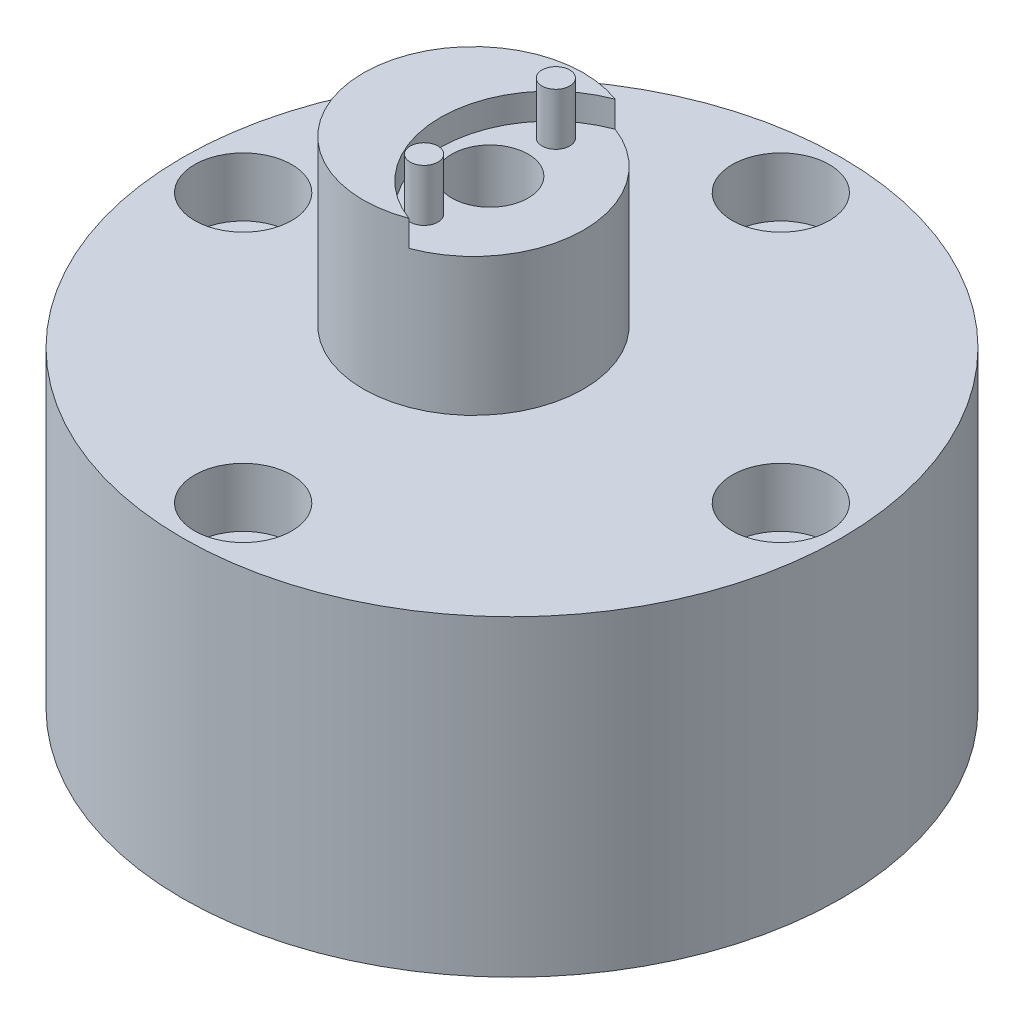
ISO-10303-21;
HEADER;
FILE_DESCRIPTION(('STEP AP214'),'2;1');
FILE_NAME('part.step','',(''),(''),'','','');
FILE_SCHEMA(('AUTOMOTIVE_DESIGN { 1 0 10303 214 1 1 1 1 }'));
ENDSEC;
DATA;
#1=APPLICATION_CONTEXT('core data for automotive mechanical design processes');
#2=APPLICATION_PROTOCOL_DEFINITION('international standard','automotive_design',2000,#1);
#3=PRODUCT_CONTEXT('',#1,'mechanical');
#4=PRODUCT('Part','Part','',(#3));
#5=PRODUCT_RELATED_PRODUCT_CATEGORY('part','',(#4));
#6=PRODUCT_DEFINITION_FORMATION('','',#4);
#7=PRODUCT_DEFINITION_CONTEXT('part definition',#1,'design');
#8=PRODUCT_DEFINITION('design','',#6,#7);
#9=PRODUCT_DEFINITION_SHAPE('','',#8);
#10=(LENGTH_UNIT() NAMED_UNIT(*) SI_UNIT(.MILLI.,.METRE.));
#11=(NAMED_UNIT(*) PLANE_ANGLE_UNIT() SI_UNIT($,.RADIAN.));
#12=(NAMED_UNIT(*) SI_UNIT($,.STERADIAN.) SOLID_ANGLE_UNIT());
#13=UNCERTAINTY_MEASURE_WITH_UNIT(LENGTH_MEASURE(1.E-05),#10,'distance_accuracy_value','');
#14=(GEOMETRIC_REPRESENTATION_CONTEXT(3) GLOBAL_UNCERTAINTY_ASSIGNED_CONTEXT((#13)) GLOBAL_UNIT_ASSIGNED_CONTEXT((#10,
#11,#12)) REPRESENTATION_CONTEXT('',''));
#15=CARTESIAN_POINT('',(0.,0.,0.));
#16=DIRECTION('',(0.,0.,1.));
#17=DIRECTION('',(1.,0.,0.));
#18=AXIS2_PLACEMENT_3D('',#15,#16,#17);
#19=CARTESIAN_POINT('',(0.952245999999999,-18.,0.));
#20=DIRECTION('',(0.,1.,0.));
#21=DIRECTION('',(0.,0.,1.));
#22=AXIS2_PLACEMENT_3D('',#19,#20,#21);
#23=CYLINDRICAL_SURFACE('',#22,2.2);
#24=CARTESIAN_POINT('',(0.952245999999999,7.9375,0.));
#25=DIRECTION('',(0.,1.,0.));
#26=DIRECTION('',(0.,0.,1.));
#27=AXIS2_PLACEMENT_3D('',#24,#25,#26);
#28=CIRCLE('',#27,2.2);
#29=CARTESIAN_POINT('',(0.952245999999999,7.9375,2.2));
#30=VERTEX_POINT('',#29);
#31=EDGE_CURVE('E91',#30,#30,#28,.T.);
#32=ORIENTED_EDGE('',*,*,#31,.T.);
#33=EDGE_LOOP('',(#32));
#34=FACE_BOUND('',#33,.T.);
#35=CARTESIAN_POINT('',(0.952245999999999,-8.,0.));
#36=DIRECTION('',(0.,-1.,0.));
#37=DIRECTION('',(0.,0.,-1.));
#38=AXIS2_PLACEMENT_3D('',#35,#36,#37);
#39=CIRCLE('',#38,2.2);
#40=CARTESIAN_POINT('',(0.952245999999999,-8.,-2.2));
#41=VERTEX_POINT('',#40);
#42=EDGE_CURVE('E48',#41,#41,#39,.F.);
#43=ORIENTED_EDGE('',*,*,#42,.F.);
#44=EDGE_LOOP('',(#43));
#45=FACE_BOUND('',#44,.T.);
#46=ADVANCED_FACE('F44',(#34,#45),#23,.F.);
#47=CARTESIAN_POINT('',(0.,7.9375,0.));
#48=DIRECTION('',(0.,1.,0.));
#49=DIRECTION('',(0.,0.,1.));
#50=AXIS2_PLACEMENT_3D('',#47,#48,#49);
#51=PLANE('',#50);
#52=CARTESIAN_POINT('',(0.952245999999999,7.9375,3.8));
#53=DIRECTION('',(0.,1.,0.));
#54=DIRECTION('',(0.,0.,1.));
#55=AXIS2_PLACEMENT_3D('',#52,#53,#54);
#56=CIRCLE('',#55,0.8);
#57=CARTESIAN_POINT('',(0.952245999999999,7.9375,4.6));
#58=VERTEX_POINT('',#57);
#59=EDGE_CURVE('E525',#58,#58,#56,.T.);
#60=ORIENTED_EDGE('',*,*,#59,.F.);
#61=EDGE_LOOP('',(#60));
#62=FACE_BOUND('',#61,.T.);
#63=CARTESIAN_POINT('',(0.952245999999999,7.9375,-3.8));
#64=DIRECTION('',(0.,1.,0.));
#65=DIRECTION('',(0.,0.,1.));
#66=AXIS2_PLACEMENT_3D('',#63,#64,#65);
#67=CIRCLE('',#66,0.8);
#68=CARTESIAN_POINT('',(0.952245999999999,7.9375,-3.));
#69=VERTEX_POINT('',#68);
#70=EDGE_CURVE('E529',#69,#69,#67,.T.);
#71=ORIENTED_EDGE('',*,*,#70,.F.);
#72=EDGE_LOOP('',(#71));
#73=FACE_BOUND('',#72,.T.);
#74=ORIENTED_EDGE('',*,*,#31,.F.);
#75=EDGE_LOOP('',(#74));
#76=FACE_BOUND('',#75,.T.);
#77=CARTESIAN_POINT('',(4.442246,7.9375,0.));
#78=DIRECTION('',(0.,-1.,0.));
#79=DIRECTION('',(0.,0.,1.));
#80=AXIS2_PLACEMENT_3D('',#77,#78,#79);
#81=CIRCLE('',#80,6.35);
#82=CARTESIAN_POINT('',(2.221123,7.9375,5.94887490361589));
#83=VERTEX_POINT('',#82);
#84=CARTESIAN_POINT('',(2.221123,7.9375,-5.94887490361589));
#85=VERTEX_POINT('',#84);
#86=EDGE_CURVE('E60',#83,#85,#81,.T.);
#87=ORIENTED_EDGE('',*,*,#86,.F.);
#88=CARTESIAN_POINT('',(0.,7.9375,0.));
#89=DIRECTION('',(0.,1.,0.));
#90=DIRECTION('',(0.,0.,1.));
#91=AXIS2_PLACEMENT_3D('',#88,#89,#90);
#92=CIRCLE('',#91,6.35);
#93=EDGE_CURVE('E11',#83,#85,#92,.T.);
#94=ORIENTED_EDGE('',*,*,#93,.T.);
#95=EDGE_LOOP('',(#87,#94));
#96=FACE_BOUND('',#95,.T.);
#97=ADVANCED_FACE('F72',(#62,#73,#76,#96),#51,.T.);
#98=CARTESIAN_POINT('',(-13.277754,7.9375,0.));
#99=DIRECTION('',(0.,-1.,0.));
#100=DIRECTION('',(0.,0.,-1.));
#101=AXIS2_PLACEMENT_3D('',#98,#99,#100);
#102=CYLINDRICAL_SURFACE('',#101,1.7);
#103=CARTESIAN_POINT('',(-13.277754,-18.,0.));
#104=DIRECTION('',(0.,-1.,0.));
#105=DIRECTION('',(0.,0.,-1.));
#106=AXIS2_PLACEMENT_3D('',#103,#104,#105);
#107=CIRCLE('',#106,1.7);
#108=CARTESIAN_POINT('',(-13.277754,-18.,-1.7));
#109=VERTEX_POINT('',#108);
#110=EDGE_CURVE('E144',#109,#109,#107,.T.);
#111=ORIENTED_EDGE('',*,*,#110,.T.);
#112=EDGE_LOOP('',(#111));
#113=FACE_BOUND('',#112,.T.);
#114=CARTESIAN_POINT('',(-13.277754,-3.4,0.));
#115=DIRECTION('',(0.,1.,0.));
#116=DIRECTION('',(0.,0.,1.));
#117=AXIS2_PLACEMENT_3D('',#114,#115,#116);
#118=CIRCLE('',#117,1.7);
#119=CARTESIAN_POINT('',(-13.277754,-3.4,1.7));
#120=VERTEX_POINT('',#119);
#121=EDGE_CURVE('E148',#120,#120,#118,.F.);
#122=ORIENTED_EDGE('',*,*,#121,.F.);
#123=EDGE_LOOP('',(#122));
#124=FACE_BOUND('',#123,.T.);
#125=ADVANCED_FACE('F175',(#113,#124),#102,.F.);
#126=CARTESIAN_POINT('',(2.222246,7.9375,-15.5));
#127=DIRECTION('',(0.,-1.,0.));
#128=DIRECTION('',(0.,0.,-1.));
#129=AXIS2_PLACEMENT_3D('',#126,#127,#128);
#130=CYLINDRICAL_SURFACE('',#129,1.7);
#131=CARTESIAN_POINT('',(2.222246,-18.,-15.5));
#132=DIRECTION('',(0.,-1.,0.));
#133=DIRECTION('',(0.,0.,-1.));
#134=AXIS2_PLACEMENT_3D('',#131,#132,#133);
#135=CIRCLE('',#134,1.7);
#136=CARTESIAN_POINT('',(2.222246,-18.,-17.2));
#137=VERTEX_POINT('',#136);
#138=EDGE_CURVE('E140',#137,#137,#135,.T.);
#139=ORIENTED_EDGE('',*,*,#138,.T.);
#140=EDGE_LOOP('',(#139));
#141=FACE_BOUND('',#140,.T.);
#142=CARTESIAN_POINT('',(2.222246,-3.4,-15.5));
#143=DIRECTION('',(0.,1.,0.));
#144=DIRECTION('',(0.,0.,1.));
#145=AXIS2_PLACEMENT_3D('',#142,#143,#144);
#146=CIRCLE('',#145,1.7);
#147=CARTESIAN_POINT('',(2.222246,-3.4,-13.8));
#148=VERTEX_POINT('',#147);
#149=EDGE_CURVE('E166',#148,#148,#146,.F.);
#150=ORIENTED_EDGE('',*,*,#149,.F.);
#151=EDGE_LOOP('',(#150));
#152=FACE_BOUND('',#151,.T.);
#153=ADVANCED_FACE('F177',(#141,#152),#130,.F.);
#154=CARTESIAN_POINT('',(17.722246,7.9375,0.));
#155=DIRECTION('',(0.,-1.,0.));
#156=DIRECTION('',(0.,0.,-1.));
#157=AXIS2_PLACEMENT_3D('',#154,#155,#156);
#158=CYLINDRICAL_SURFACE('',#157,1.7);
#159=CARTESIAN_POINT('',(17.722246,-18.,0.));
#160=DIRECTION('',(0.,-1.,0.));
#161=DIRECTION('',(0.,0.,-1.));
#162=AXIS2_PLACEMENT_3D('',#159,#160,#161);
#163=CIRCLE('',#162,1.7);
#164=CARTESIAN_POINT('',(17.722246,-18.,-1.7));
#165=VERTEX_POINT('',#164);
#166=EDGE_CURVE('E136',#165,#165,#163,.T.);
#167=ORIENTED_EDGE('',*,*,#166,.T.);
#168=EDGE_LOOP('',(#167));
#169=FACE_BOUND('',#168,.T.);
#170=CARTESIAN_POINT('',(17.722246,-3.4,0.));
#171=DIRECTION('',(0.,1.,0.));
#172=DIRECTION('',(0.,0.,1.));
#173=AXIS2_PLACEMENT_3D('',#170,#171,#172);
#174=CIRCLE('',#173,1.7);
#175=CARTESIAN_POINT('',(17.722246,-3.4,1.7));
#176=VERTEX_POINT('',#175);
#177=EDGE_CURVE('E162',#176,#176,#174,.F.);
#178=ORIENTED_EDGE('',*,*,#177,.F.);
#179=EDGE_LOOP('',(#178));
#180=FACE_BOUND('',#179,.T.);
#181=ADVANCED_FACE('F184',(#169,#180),#158,.F.);
#182=CARTESIAN_POINT('',(2.222246,7.9375,15.5));
#183=DIRECTION('',(0.,-1.,0.));
#184=DIRECTION('',(0.,0.,-1.));
#185=AXIS2_PLACEMENT_3D('',#182,#183,#184);
#186=CYLINDRICAL_SURFACE('',#185,1.7);
#187=CARTESIAN_POINT('',(2.222246,-18.,15.5));
#188=DIRECTION('',(0.,-1.,0.));
#189=DIRECTION('',(0.,0.,-1.));
#190=AXIS2_PLACEMENT_3D('',#187,#188,#189);
#191=CIRCLE('',#190,1.7);
#192=CARTESIAN_POINT('',(2.222246,-18.,13.8));
#193=VERTEX_POINT('',#192);
#194=EDGE_CURVE('E131',#193,#193,#191,.T.);
#195=ORIENTED_EDGE('',*,*,#194,.T.);
#196=EDGE_LOOP('',(#195));
#197=FACE_BOUND('',#196,.T.);
#198=CARTESIAN_POINT('',(2.222246,-3.4,15.5));
#199=DIRECTION('',(0.,1.,0.));
#200=DIRECTION('',(0.,0.,1.));
#201=AXIS2_PLACEMENT_3D('',#198,#199,#200);
#202=CIRCLE('',#201,1.7);
#203=CARTESIAN_POINT('',(2.222246,-3.4,17.2));
#204=VERTEX_POINT('',#203);
#205=EDGE_CURVE('E103',#204,#204,#202,.F.);
#206=ORIENTED_EDGE('',*,*,#205,.F.);
#207=EDGE_LOOP('',(#206));
#208=FACE_BOUND('',#207,.T.);
#209=ADVANCED_FACE('F232',(#197,#208),#186,.F.);
#210=CARTESIAN_POINT('',(0.,7.9375,0.));
#211=DIRECTION('',(0.,-1.,0.));
#212=DIRECTION('',(0.,0.,-1.));
#213=AXIS2_PLACEMENT_3D('',#210,#211,#212);
#214=CYLINDRICAL_SURFACE('',#213,6.35);
#215=ORIENTED_EDGE('',*,*,#93,.F.);
#216=DIRECTION('',(0.,-1.,0.));
#217=VECTOR('',#216,1.);
#218=CARTESIAN_POINT('',(2.22112299999999,9.4375,5.94887490361589));
#219=LINE('',#218,#217);
#220=CARTESIAN_POINT('',(2.22112299999999,9.4375,5.94887490361589));
#221=VERTEX_POINT('',#220);
#222=EDGE_CURVE('E81',#221,#83,#219,.T.);
#223=ORIENTED_EDGE('',*,*,#222,.F.);
#224=CARTESIAN_POINT('',(0.,9.4375,0.));
#225=DIRECTION('',(0.,1.,0.));
#226=DIRECTION('',(0.,0.,1.));
#227=AXIS2_PLACEMENT_3D('',#224,#225,#226);
#228=CIRCLE('',#227,6.35);
#229=CARTESIAN_POINT('',(2.221123,9.4375,-5.94887490361589));
#230=VERTEX_POINT('',#229);
#231=EDGE_CURVE('E83',#230,#221,#228,.T.);
#232=ORIENTED_EDGE('',*,*,#231,.F.);
#233=DIRECTION('',(0.,-1.,0.));
#234=VECTOR('',#233,1.);
#235=CARTESIAN_POINT('',(2.221123,9.4375,-5.94887490361589));
#236=LINE('',#235,#234);
#237=EDGE_CURVE('E79',#230,#85,#236,.T.);
#238=ORIENTED_EDGE('',*,*,#237,.T.);
#239=EDGE_LOOP('',(#215,#223,#232,#238));
#240=FACE_BOUND('',#239,.T.);
#241=CARTESIAN_POINT('',(0.,0.,0.));
#242=DIRECTION('',(0.,1.,0.));
#243=DIRECTION('',(0.,0.,1.));
#244=AXIS2_PLACEMENT_3D('',#241,#242,#243);
#245=CIRCLE('',#244,6.35);
#246=CARTESIAN_POINT('',(0.,0.,6.35));
#247=VERTEX_POINT('',#246);
#248=EDGE_CURVE('E54',#247,#247,#245,.T.);
#249=ORIENTED_EDGE('',*,*,#248,.T.);
#250=EDGE_LOOP('',(#249));
#251=FACE_BOUND('',#250,.T.);
#252=ADVANCED_FACE('F46',(#240,#251),#214,.T.);
#253=CARTESIAN_POINT('',(2.222246,-18.,0.));
#254=DIRECTION('',(0.,1.,0.));
#255=DIRECTION('',(0.,0.,1.));
#256=AXIS2_PLACEMENT_3D('',#253,#254,#255);
#257=CYLINDRICAL_SURFACE('',#256,19.);
#258=CARTESIAN_POINT('',(2.222246,-18.,0.));
#259=DIRECTION('',(0.,-1.,0.));
#260=DIRECTION('',(0.,0.,-1.));
#261=AXIS2_PLACEMENT_3D('',#258,#259,#260);
#262=CIRCLE('',#261,19.);
#263=CARTESIAN_POINT('',(2.222246,-18.,-19.));
#264=VERTEX_POINT('',#263);
#265=EDGE_CURVE('E149',#264,#264,#262,.T.);
#266=ORIENTED_EDGE('',*,*,#265,.F.);
#267=EDGE_LOOP('',(#266));
#268=FACE_BOUND('',#267,.T.);
#269=CARTESIAN_POINT('',(2.222246,0.,0.));
#270=DIRECTION('',(0.,-1.,0.));
#271=DIRECTION('',(0.,0.,-1.));
#272=AXIS2_PLACEMENT_3D('',#269,#270,#271);
#273=CIRCLE('',#272,19.);
#274=CARTESIAN_POINT('',(2.222246,0.,-19.));
#275=VERTEX_POINT('',#274);
#276=EDGE_CURVE('E135',#275,#275,#273,.T.);
#277=ORIENTED_EDGE('',*,*,#276,.T.);
#278=EDGE_LOOP('',(#277));
#279=FACE_BOUND('',#278,.T.);
#280=ADVANCED_FACE('F247',(#268,#279),#257,.T.);
#281=CARTESIAN_POINT('',(2.222246,-18.,0.));
#282=DIRECTION('',(0.,-1.,0.));
#283=DIRECTION('',(0.,0.,-1.));
#284=AXIS2_PLACEMENT_3D('',#281,#282,#283);
#285=PLANE('',#284);
#286=CARTESIAN_POINT('',(2.222246,-18.,0.));
#287=DIRECTION('',(0.,-1.,0.));
#288=DIRECTION('',(0.,0.,-1.));
#289=AXIS2_PLACEMENT_3D('',#286,#287,#288);
#290=CIRCLE('',#289,6.);
#291=CARTESIAN_POINT('',(2.222246,-18.,-6.));
#292=VERTEX_POINT('',#291);
#293=EDGE_CURVE('E519',#292,#292,#290,.T.);
#294=ORIENTED_EDGE('',*,*,#293,.F.);
#295=EDGE_LOOP('',(#294));
#296=FACE_BOUND('',#295,.T.);
#297=ORIENTED_EDGE('',*,*,#194,.F.);
#298=EDGE_LOOP('',(#297));
#299=FACE_BOUND('',#298,.T.);
#300=ORIENTED_EDGE('',*,*,#166,.F.);
#301=EDGE_LOOP('',(#300));
#302=FACE_BOUND('',#301,.T.);
#303=ORIENTED_EDGE('',*,*,#138,.F.);
#304=EDGE_LOOP('',(#303));
#305=FACE_BOUND('',#304,.T.);
#306=ORIENTED_EDGE('',*,*,#110,.F.);
#307=EDGE_LOOP('',(#306));
#308=FACE_BOUND('',#307,.T.);
#309=ORIENTED_EDGE('',*,*,#265,.T.);
#310=EDGE_LOOP('',(#309));
#311=FACE_BOUND('',#310,.T.);
#312=ADVANCED_FACE('F245',(#296,#299,#302,#305,#308,#311),#285,.T.);
#313=CARTESIAN_POINT('',(2.222246,0.,0.));
#314=DIRECTION('',(0.,-1.,0.));
#315=DIRECTION('',(0.,0.,-1.));
#316=AXIS2_PLACEMENT_3D('',#313,#314,#315);
#317=PLANE('',#316);
#318=CARTESIAN_POINT('',(2.222246,0.,-15.5));
#319=DIRECTION('',(0.,1.,0.));
#320=DIRECTION('',(0.,0.,1.));
#321=AXIS2_PLACEMENT_3D('',#318,#319,#320);
#322=CIRCLE('',#321,2.8);
#323=CARTESIAN_POINT('',(2.222246,0.,-12.7));
#324=VERTEX_POINT('',#323);
#325=EDGE_CURVE('E104',#324,#324,#322,.T.);
#326=ORIENTED_EDGE('',*,*,#325,.F.);
#327=EDGE_LOOP('',(#326));
#328=FACE_BOUND('',#327,.T.);
#329=CARTESIAN_POINT('',(17.722246,0.,0.));
#330=DIRECTION('',(0.,1.,0.));
#331=DIRECTION('',(0.,0.,1.));
#332=AXIS2_PLACEMENT_3D('',#329,#330,#331);
#333=CIRCLE('',#332,2.8);
#334=CARTESIAN_POINT('',(17.722246,0.,2.8));
#335=VERTEX_POINT('',#334);
#336=EDGE_CURVE('E108',#335,#335,#333,.T.);
#337=ORIENTED_EDGE('',*,*,#336,.F.);
#338=EDGE_LOOP('',(#337));
#339=FACE_BOUND('',#338,.T.);
#340=CARTESIAN_POINT('',(2.222246,0.,15.5));
#341=DIRECTION('',(0.,1.,0.));
#342=DIRECTION('',(0.,0.,1.));
#343=AXIS2_PLACEMENT_3D('',#340,#341,#342);
#344=CIRCLE('',#343,2.8);
#345=CARTESIAN_POINT('',(2.222246,0.,18.3));
#346=VERTEX_POINT('',#345);
#347=EDGE_CURVE('E116',#346,#346,#344,.T.);
#348=ORIENTED_EDGE('',*,*,#347,.F.);
#349=EDGE_LOOP('',(#348));
#350=FACE_BOUND('',#349,.T.);
#351=CARTESIAN_POINT('',(-13.277754,0.,0.));
#352=DIRECTION('',(0.,1.,0.));
#353=DIRECTION('',(0.,0.,1.));
#354=AXIS2_PLACEMENT_3D('',#351,#352,#353);
#355=CIRCLE('',#354,2.8);
#356=CARTESIAN_POINT('',(-13.277754,0.,2.8));
#357=VERTEX_POINT('',#356);
#358=EDGE_CURVE('E124',#357,#357,#355,.T.);
#359=ORIENTED_EDGE('',*,*,#358,.F.);
#360=EDGE_LOOP('',(#359));
#361=FACE_BOUND('',#360,.T.);
#362=ORIENTED_EDGE('',*,*,#248,.F.);
#363=EDGE_LOOP('',(#362));
#364=FACE_BOUND('',#363,.T.);
#365=ORIENTED_EDGE('',*,*,#276,.F.);
#366=EDGE_LOOP('',(#365));
#367=FACE_BOUND('',#366,.T.);
#368=ADVANCED_FACE('F223',(#328,#339,#350,#361,#364,#367),#317,.F.);
#369=CARTESIAN_POINT('',(2.222246,-3.4,15.5));
#370=DIRECTION('',(0.,1.,0.));
#371=DIRECTION('',(0.,0.,1.));
#372=AXIS2_PLACEMENT_3D('',#369,#370,#371);
#373=PLANE('',#372);
#374=CARTESIAN_POINT('',(2.222246,-3.4,15.5));
#375=DIRECTION('',(0.,1.,0.));
#376=DIRECTION('',(0.,0.,1.));
#377=AXIS2_PLACEMENT_3D('',#374,#375,#376);
#378=CIRCLE('',#377,2.8);
#379=CARTESIAN_POINT('',(2.222246,-3.4,18.3));
#380=VERTEX_POINT('',#379);
#381=EDGE_CURVE('E120',#380,#380,#378,.T.);
#382=ORIENTED_EDGE('',*,*,#381,.T.);
#383=EDGE_LOOP('',(#382));
#384=FACE_BOUND('',#383,.T.);
#385=ORIENTED_EDGE('',*,*,#205,.T.);
#386=EDGE_LOOP('',(#385));
#387=FACE_BOUND('',#386,.T.);
#388=ADVANCED_FACE('F219',(#384,#387),#373,.T.);
#389=CARTESIAN_POINT('',(2.222246,-3.4,15.5));
#390=DIRECTION('',(0.,1.,0.));
#391=DIRECTION('',(0.,0.,1.));
#392=AXIS2_PLACEMENT_3D('',#389,#390,#391);
#393=CYLINDRICAL_SURFACE('',#392,2.8);
#394=ORIENTED_EDGE('',*,*,#381,.F.);
#395=EDGE_LOOP('',(#394));
#396=FACE_BOUND('',#395,.T.);
#397=ORIENTED_EDGE('',*,*,#347,.T.);
#398=EDGE_LOOP('',(#397));
#399=FACE_BOUND('',#398,.T.);
#400=ADVANCED_FACE('F215',(#396,#399),#393,.F.);
#401=CARTESIAN_POINT('',(17.722246,-3.4,0.));
#402=DIRECTION('',(0.,1.,0.));
#403=DIRECTION('',(0.,0.,1.));
#404=AXIS2_PLACEMENT_3D('',#401,#402,#403);
#405=PLANE('',#404);
#406=CARTESIAN_POINT('',(17.722246,-3.4,0.));
#407=DIRECTION('',(0.,1.,0.));
#408=DIRECTION('',(0.,0.,1.));
#409=AXIS2_PLACEMENT_3D('',#406,#407,#408);
#410=CIRCLE('',#409,2.8);
#411=CARTESIAN_POINT('',(17.722246,-3.4,2.8));
#412=VERTEX_POINT('',#411);
#413=EDGE_CURVE('E112',#412,#412,#410,.T.);
#414=ORIENTED_EDGE('',*,*,#413,.T.);
#415=EDGE_LOOP('',(#414));
#416=FACE_BOUND('',#415,.T.);
#417=ORIENTED_EDGE('',*,*,#177,.T.);
#418=EDGE_LOOP('',(#417));
#419=FACE_BOUND('',#418,.T.);
#420=ADVANCED_FACE('F211',(#416,#419),#405,.T.);
#421=CARTESIAN_POINT('',(17.722246,-3.4,0.));
#422=DIRECTION('',(0.,1.,0.));
#423=DIRECTION('',(0.,0.,1.));
#424=AXIS2_PLACEMENT_3D('',#421,#422,#423);
#425=CYLINDRICAL_SURFACE('',#424,2.8);
#426=ORIENTED_EDGE('',*,*,#413,.F.);
#427=EDGE_LOOP('',(#426));
#428=FACE_BOUND('',#427,.T.);
#429=ORIENTED_EDGE('',*,*,#336,.T.);
#430=EDGE_LOOP('',(#429));
#431=FACE_BOUND('',#430,.T.);
#432=ADVANCED_FACE('F204',(#428,#431),#425,.F.);
#433=CARTESIAN_POINT('',(2.222246,-3.4,-15.5));
#434=DIRECTION('',(0.,1.,0.));
#435=DIRECTION('',(0.,0.,1.));
#436=AXIS2_PLACEMENT_3D('',#433,#434,#435);
#437=PLANE('',#436);
#438=CARTESIAN_POINT('',(2.222246,-3.4,-15.5));
#439=DIRECTION('',(0.,1.,0.));
#440=DIRECTION('',(0.,0.,1.));
#441=AXIS2_PLACEMENT_3D('',#438,#439,#440);
#442=CIRCLE('',#441,2.8);
#443=CARTESIAN_POINT('',(2.222246,-3.4,-12.7));
#444=VERTEX_POINT('',#443);
#445=EDGE_CURVE('E99',#444,#444,#442,.T.);
#446=ORIENTED_EDGE('',*,*,#445,.T.);
#447=EDGE_LOOP('',(#446));
#448=FACE_BOUND('',#447,.T.);
#449=ORIENTED_EDGE('',*,*,#149,.T.);
#450=EDGE_LOOP('',(#449));
#451=FACE_BOUND('',#450,.T.);
#452=ADVANCED_FACE('F200',(#448,#451),#437,.T.);
#453=CARTESIAN_POINT('',(2.222246,-3.4,-15.5));
#454=DIRECTION('',(0.,1.,0.));
#455=DIRECTION('',(0.,0.,1.));
#456=AXIS2_PLACEMENT_3D('',#453,#454,#455);
#457=CYLINDRICAL_SURFACE('',#456,2.8);
#458=ORIENTED_EDGE('',*,*,#445,.F.);
#459=EDGE_LOOP('',(#458));
#460=FACE_BOUND('',#459,.T.);
#461=ORIENTED_EDGE('',*,*,#325,.T.);
#462=EDGE_LOOP('',(#461));
#463=FACE_BOUND('',#462,.T.);
#464=ADVANCED_FACE('F203',(#460,#463),#457,.F.);
#465=CARTESIAN_POINT('',(-13.277754,-3.4,0.));
#466=DIRECTION('',(0.,1.,0.));
#467=DIRECTION('',(0.,0.,1.));
#468=AXIS2_PLACEMENT_3D('',#465,#466,#467);
#469=PLANE('',#468);
#470=CARTESIAN_POINT('',(-13.277754,-3.4,0.));
#471=DIRECTION('',(0.,1.,0.));
#472=DIRECTION('',(0.,0.,1.));
#473=AXIS2_PLACEMENT_3D('',#470,#471,#472);
#474=CIRCLE('',#473,2.8);
#475=CARTESIAN_POINT('',(-13.277754,-3.4,2.8));
#476=VERTEX_POINT('',#475);
#477=EDGE_CURVE('E98',#476,#476,#474,.T.);
#478=ORIENTED_EDGE('',*,*,#477,.T.);
#479=EDGE_LOOP('',(#478));
#480=FACE_BOUND('',#479,.T.);
#481=ORIENTED_EDGE('',*,*,#121,.T.);
#482=EDGE_LOOP('',(#481));
#483=FACE_BOUND('',#482,.T.);
#484=ADVANCED_FACE('F173',(#480,#483),#469,.T.);
#485=CARTESIAN_POINT('',(-13.277754,-3.4,0.));
#486=DIRECTION('',(0.,1.,0.));
#487=DIRECTION('',(0.,0.,1.));
#488=AXIS2_PLACEMENT_3D('',#485,#486,#487);
#489=CYLINDRICAL_SURFACE('',#488,2.8);
#490=ORIENTED_EDGE('',*,*,#477,.F.);
#491=EDGE_LOOP('',(#490));
#492=FACE_BOUND('',#491,.T.);
#493=ORIENTED_EDGE('',*,*,#358,.T.);
#494=EDGE_LOOP('',(#493));
#495=FACE_BOUND('',#494,.T.);
#496=ADVANCED_FACE('F225',(#492,#495),#489,.F.);
#497=CARTESIAN_POINT('',(4.442246,9.4375,0.));
#498=DIRECTION('',(0.,-1.,0.));
#499=DIRECTION('',(0.,0.,-1.));
#500=AXIS2_PLACEMENT_3D('',#497,#498,#499);
#501=CYLINDRICAL_SURFACE('',#500,6.35);
#502=ORIENTED_EDGE('',*,*,#86,.T.);
#503=ORIENTED_EDGE('',*,*,#237,.F.);
#504=CARTESIAN_POINT('',(4.442246,9.4375,0.));
#505=DIRECTION('',(0.,-1.,0.));
#506=DIRECTION('',(0.,0.,1.));
#507=AXIS2_PLACEMENT_3D('',#504,#505,#506);
#508=CIRCLE('',#507,6.35);
#509=EDGE_CURVE('E68',#221,#230,#508,.T.);
#510=ORIENTED_EDGE('',*,*,#509,.F.);
#511=ORIENTED_EDGE('',*,*,#222,.T.);
#512=EDGE_LOOP('',(#502,#503,#510,#511));
#513=FACE_BOUND('',#512,.T.);
#514=ADVANCED_FACE('F78',(#513),#501,.F.);
#515=CARTESIAN_POINT('',(2.221123,9.4375,0.));
#516=DIRECTION('',(0.,1.,0.));
#517=DIRECTION('',(0.,0.,1.));
#518=AXIS2_PLACEMENT_3D('',#515,#516,#517);
#519=PLANE('',#518);
#520=ORIENTED_EDGE('',*,*,#231,.T.);
#521=ORIENTED_EDGE('',*,*,#509,.T.);
#522=EDGE_LOOP('',(#520,#521));
#523=FACE_BOUND('',#522,.T.);
#524=ADVANCED_FACE('F336',(#523),#519,.T.);
#525=CARTESIAN_POINT('',(0.952245999999999,10.9375,-3.8));
#526=DIRECTION('',(0.,-1.,0.));
#527=DIRECTION('',(0.,0.,-1.));
#528=AXIS2_PLACEMENT_3D('',#525,#526,#527);
#529=CYLINDRICAL_SURFACE('',#528,0.8);
#530=CARTESIAN_POINT('',(0.952245999999999,10.9375,-3.8));
#531=DIRECTION('',(0.,1.,0.));
#532=DIRECTION('',(0.,0.,1.));
#533=AXIS2_PLACEMENT_3D('',#530,#531,#532);
#534=CIRCLE('',#533,0.8);
#535=CARTESIAN_POINT('',(0.952245999999999,10.9375,-3.));
#536=VERTEX_POINT('',#535);
#537=EDGE_CURVE('E84',#536,#536,#534,.T.);
#538=ORIENTED_EDGE('',*,*,#537,.F.);
#539=EDGE_LOOP('',(#538));
#540=FACE_BOUND('',#539,.T.);
#541=ORIENTED_EDGE('',*,*,#70,.T.);
#542=EDGE_LOOP('',(#541));
#543=FACE_BOUND('',#542,.T.);
#544=ADVANCED_FACE('F342',(#540,#543),#529,.T.);
#545=CARTESIAN_POINT('',(0.952245999999999,10.9375,-3.8));
#546=DIRECTION('',(0.,1.,0.));
#547=DIRECTION('',(0.,0.,1.));
#548=AXIS2_PLACEMENT_3D('',#545,#546,#547);
#549=PLANE('',#548);
#550=ORIENTED_EDGE('',*,*,#537,.T.);
#551=EDGE_LOOP('',(#550));
#552=FACE_BOUND('',#551,.T.);
#553=ADVANCED_FACE('F349',(#552),#549,.T.);
#554=CARTESIAN_POINT('',(0.952245999999999,10.9375,3.8));
#555=DIRECTION('',(0.,-1.,0.));
#556=DIRECTION('',(0.,0.,-1.));
#557=AXIS2_PLACEMENT_3D('',#554,#555,#556);
#558=CYLINDRICAL_SURFACE('',#557,0.8);
#559=CARTESIAN_POINT('',(0.952245999999999,10.9375,3.8));
#560=DIRECTION('',(0.,1.,0.));
#561=DIRECTION('',(0.,0.,1.));
#562=AXIS2_PLACEMENT_3D('',#559,#560,#561);
#563=CIRCLE('',#562,0.8);
#564=CARTESIAN_POINT('',(0.952245999999999,10.9375,4.6));
#565=VERTEX_POINT('',#564);
#566=EDGE_CURVE('E530',#565,#565,#563,.T.);
#567=ORIENTED_EDGE('',*,*,#566,.F.);
#568=EDGE_LOOP('',(#567));
#569=FACE_BOUND('',#568,.T.);
#570=ORIENTED_EDGE('',*,*,#59,.T.);
#571=EDGE_LOOP('',(#570));
#572=FACE_BOUND('',#571,.T.);
#573=ADVANCED_FACE('F357',(#569,#572),#558,.T.);
#574=CARTESIAN_POINT('',(0.952245999999999,10.9375,3.8));
#575=DIRECTION('',(0.,1.,0.));
#576=DIRECTION('',(0.,0.,1.));
#577=AXIS2_PLACEMENT_3D('',#574,#575,#576);
#578=PLANE('',#577);
#579=ORIENTED_EDGE('',*,*,#566,.T.);
#580=EDGE_LOOP('',(#579));
#581=FACE_BOUND('',#580,.T.);
#582=ADVANCED_FACE('F365',(#581),#578,.T.);
#583=CARTESIAN_POINT('',(2.222246,-8.,0.));
#584=DIRECTION('',(0.,-1.,0.));
#585=DIRECTION('',(0.,0.,-1.));
#586=AXIS2_PLACEMENT_3D('',#583,#584,#585);
#587=PLANE('',#586);
#588=CARTESIAN_POINT('',(2.222246,-8.,0.));
#589=DIRECTION('',(0.,-1.,0.));
#590=DIRECTION('',(0.,0.,-1.));
#591=AXIS2_PLACEMENT_3D('',#588,#589,#590);
#592=CIRCLE('',#591,6.);
#593=CARTESIAN_POINT('',(2.222246,-8.,-6.));
#594=VERTEX_POINT('',#593);
#595=EDGE_CURVE('E516',#594,#594,#592,.T.);
#596=ORIENTED_EDGE('',*,*,#595,.T.);
#597=EDGE_LOOP('',(#596));
#598=FACE_BOUND('',#597,.T.);
#599=ORIENTED_EDGE('',*,*,#42,.T.);
#600=EDGE_LOOP('',(#599));
#601=FACE_BOUND('',#600,.T.);
#602=ADVANCED_FACE('F373',(#598,#601),#587,.T.);
#603=CARTESIAN_POINT('',(2.222246,-8.,0.));
#604=DIRECTION('',(0.,-1.,0.));
#605=DIRECTION('',(0.,0.,-1.));
#606=AXIS2_PLACEMENT_3D('',#603,#604,#605);
#607=CYLINDRICAL_SURFACE('',#606,6.);
#608=ORIENTED_EDGE('',*,*,#595,.F.);
#609=EDGE_LOOP('',(#608));
#610=FACE_BOUND('',#609,.T.);
#611=ORIENTED_EDGE('',*,*,#293,.T.);
#612=EDGE_LOOP('',(#611));
#613=FACE_BOUND('',#612,.T.);
#614=ADVANCED_FACE('F388',(#610,#613),#607,.F.);
#615=CLOSED_SHELL('',(#46,#97,#125,#153,#181,#209,#252,#280,#312,#368,#388,#400,#420,#432,#452,
#464,#484,#496,#514,#524,#544,#553,#573,#582,#602,#614));
#616=MANIFOLD_SOLID_BREP('B2',#615);
#617=ADVANCED_BREP_SHAPE_REPRESENTATION('',(#18,#616),#14);
#618=SHAPE_DEFINITION_REPRESENTATION(#9,#617);
ENDSEC;
END-ISO-10303-21;
